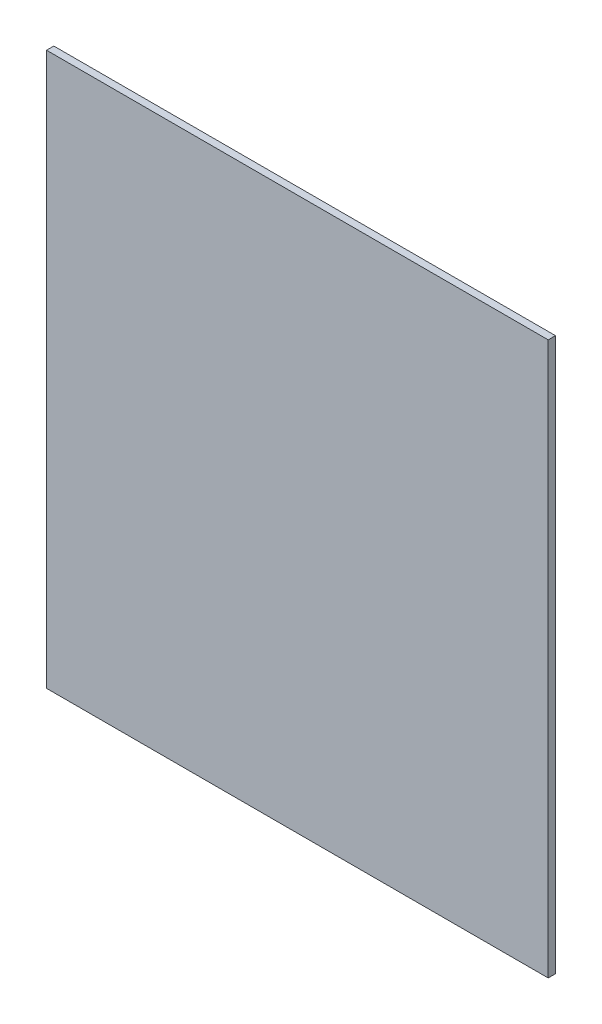
ISO-10303-21;
HEADER;
FILE_DESCRIPTION(('STEP AP214'),'2;1');
FILE_NAME('part.step','',(''),(''),'','','');
FILE_SCHEMA(('AUTOMOTIVE_DESIGN { 1 0 10303 214 1 1 1 1 }'));
ENDSEC;
DATA;
#1=APPLICATION_CONTEXT('core data for automotive mechanical design processes');
#2=APPLICATION_PROTOCOL_DEFINITION('international standard','automotive_design',2000,#1);
#3=PRODUCT_CONTEXT('',#1,'mechanical');
#4=PRODUCT('Part','Part','',(#3));
#5=PRODUCT_RELATED_PRODUCT_CATEGORY('part','',(#4));
#6=PRODUCT_DEFINITION_FORMATION('','',#4);
#7=PRODUCT_DEFINITION_CONTEXT('part definition',#1,'design');
#8=PRODUCT_DEFINITION('design','',#6,#7);
#9=PRODUCT_DEFINITION_SHAPE('','',#8);
#10=(LENGTH_UNIT() NAMED_UNIT(*) SI_UNIT(.MILLI.,.METRE.));
#11=(NAMED_UNIT(*) PLANE_ANGLE_UNIT() SI_UNIT($,.RADIAN.));
#12=(NAMED_UNIT(*) SI_UNIT($,.STERADIAN.) SOLID_ANGLE_UNIT());
#13=UNCERTAINTY_MEASURE_WITH_UNIT(LENGTH_MEASURE(1.E-05),#10,'distance_accuracy_value','');
#14=(GEOMETRIC_REPRESENTATION_CONTEXT(3) GLOBAL_UNCERTAINTY_ASSIGNED_CONTEXT((#13)) GLOBAL_UNIT_ASSIGNED_CONTEXT((#10,
#11,#12)) REPRESENTATION_CONTEXT('',''));
#15=CARTESIAN_POINT('',(0.,0.,0.));
#16=DIRECTION('',(0.,0.,1.));
#17=DIRECTION('',(1.,0.,0.));
#18=AXIS2_PLACEMENT_3D('',#15,#16,#17);
#19=CARTESIAN_POINT('',(0.,0.,0.));
#20=DIRECTION('',(0.,0.,1.));
#21=DIRECTION('',(1.,0.,0.));
#22=AXIS2_PLACEMENT_3D('',#19,#20,#21);
#23=PLANE('',#22);
#24=DIRECTION('',(0.,-1.,0.));
#25=VECTOR('',#24,1.);
#26=CARTESIAN_POINT('',(-28.9650792305083,6.16507923050825,0.));
#27=LINE('',#26,#25);
#28=CARTESIAN_POINT('',(-28.9650792305083,6.16507923050825,0.));
#29=VERTEX_POINT('',#28);
#30=CARTESIAN_POINT('',(-28.9650792305083,-69.7650792305083,0.));
#31=VERTEX_POINT('',#30);
#32=EDGE_CURVE('E118',#29,#31,#27,.T.);
#33=ORIENTED_EDGE('',*,*,#32,.F.);
#34=DIRECTION('',(-1.,0.,0.));
#35=VECTOR('',#34,1.);
#36=CARTESIAN_POINT('',(39.9650792305082,6.16507923050826,0.));
#37=LINE('',#36,#35);
#38=CARTESIAN_POINT('',(39.9650792305082,6.16507923050826,0.));
#39=VERTEX_POINT('',#38);
#40=EDGE_CURVE('E131',#39,#29,#37,.T.);
#41=ORIENTED_EDGE('',*,*,#40,.F.);
#42=DIRECTION('',(0.,1.,0.));
#43=VECTOR('',#42,1.);
#44=CARTESIAN_POINT('',(39.9650792305082,-69.7650792305082,0.));
#45=LINE('',#44,#43);
#46=CARTESIAN_POINT('',(39.9650792305082,-69.7650792305082,0.));
#47=VERTEX_POINT('',#46);
#48=EDGE_CURVE('E139',#47,#39,#45,.T.);
#49=ORIENTED_EDGE('',*,*,#48,.F.);
#50=DIRECTION('',(1.,0.,0.));
#51=VECTOR('',#50,1.);
#52=CARTESIAN_POINT('',(-28.9650792305083,-69.7650792305083,0.));
#53=LINE('',#52,#51);
#54=EDGE_CURVE('E121',#31,#47,#53,.T.);
#55=ORIENTED_EDGE('',*,*,#54,.F.);
#56=EDGE_LOOP('',(#33,#41,#49,#55));
#57=FACE_BOUND('',#56,.T.);
#58=DIRECTION('',(1.,0.,0.));
#59=VECTOR('',#58,1.);
#60=CARTESIAN_POINT('',(-5.46507923050828,-60.4650792305083,0.));
#61=LINE('',#60,#59);
#62=CARTESIAN_POINT('',(-5.46507923050828,-60.4650792305083,0.));
#63=VERTEX_POINT('',#62);
#64=CARTESIAN_POINT('',(18.5349207694917,-60.4650792305083,0.));
#65=VERTEX_POINT('',#64);
#66=EDGE_CURVE('E117',#63,#65,#61,.T.);
#67=ORIENTED_EDGE('',*,*,#66,.F.);
#68=DIRECTION('',(0.,1.,0.));
#69=VECTOR('',#68,1.);
#70=CARTESIAN_POINT('',(-5.46507923050828,-64.4650792305083,0.));
#71=LINE('',#70,#69);
#72=CARTESIAN_POINT('',(-5.46507923050828,-64.4650792305083,0.));
#73=VERTEX_POINT('',#72);
#74=EDGE_CURVE('E114',#73,#63,#71,.T.);
#75=ORIENTED_EDGE('',*,*,#74,.F.);
#76=DIRECTION('',(-1.,0.,0.));
#77=VECTOR('',#76,1.);
#78=CARTESIAN_POINT('',(18.5349207694917,-64.4650792305083,0.));
#79=LINE('',#78,#77);
#80=CARTESIAN_POINT('',(18.5349207694917,-64.4650792305083,0.));
#81=VERTEX_POINT('',#80);
#82=EDGE_CURVE('E52',#81,#73,#79,.T.);
#83=ORIENTED_EDGE('',*,*,#82,.F.);
#84=DIRECTION('',(0.,-1.,0.));
#85=VECTOR('',#84,1.);
#86=CARTESIAN_POINT('',(18.5349207694917,-60.4650792305083,0.));
#87=LINE('',#86,#85);
#88=EDGE_CURVE('E47',#65,#81,#87,.T.);
#89=ORIENTED_EDGE('',*,*,#88,.F.);
#90=EDGE_LOOP('',(#67,#75,#83,#89));
#91=FACE_BOUND('',#90,.T.);
#92=ADVANCED_FACE('F32',(#57,#91),#23,.F.);
#93=CARTESIAN_POINT('',(-28.9650792305083,6.16507923050825,1.));
#94=DIRECTION('',(1.,0.,0.));
#95=DIRECTION('',(0.,0.,-1.));
#96=AXIS2_PLACEMENT_3D('',#93,#94,#95);
#97=PLANE('',#96);
#98=ORIENTED_EDGE('',*,*,#32,.T.);
#99=DIRECTION('',(0.,0.,-1.));
#100=VECTOR('',#99,1.);
#101=CARTESIAN_POINT('',(-28.9650792305083,-69.7650792305083,1.));
#102=LINE('',#101,#100);
#103=CARTESIAN_POINT('',(-28.9650792305083,-69.7650792305083,1.));
#104=VERTEX_POINT('',#103);
#105=EDGE_CURVE('E11',#104,#31,#102,.T.);
#106=ORIENTED_EDGE('',*,*,#105,.F.);
#107=DIRECTION('',(0.,-1.,0.));
#108=VECTOR('',#107,1.);
#109=CARTESIAN_POINT('',(-28.9650792305083,6.16507923050825,1.));
#110=LINE('',#109,#108);
#111=CARTESIAN_POINT('',(-28.9650792305083,6.16507923050825,1.));
#112=VERTEX_POINT('',#111);
#113=EDGE_CURVE('E127',#112,#104,#110,.T.);
#114=ORIENTED_EDGE('',*,*,#113,.F.);
#115=DIRECTION('',(0.,0.,-1.));
#116=VECTOR('',#115,1.);
#117=CARTESIAN_POINT('',(-28.9650792305083,6.16507923050825,1.));
#118=LINE('',#117,#116);
#119=EDGE_CURVE('E136',#112,#29,#118,.T.);
#120=ORIENTED_EDGE('',*,*,#119,.T.);
#121=EDGE_LOOP('',(#98,#106,#114,#120));
#122=FACE_BOUND('',#121,.T.);
#123=ADVANCED_FACE('F34',(#122),#97,.F.);
#124=CARTESIAN_POINT('',(-28.9650792305083,-69.7650792305083,1.));
#125=DIRECTION('',(0.,1.,0.));
#126=DIRECTION('',(-1.,0.,0.));
#127=AXIS2_PLACEMENT_3D('',#124,#125,#126);
#128=PLANE('',#127);
#129=ORIENTED_EDGE('',*,*,#54,.T.);
#130=DIRECTION('',(0.,0.,-1.));
#131=VECTOR('',#130,1.);
#132=CARTESIAN_POINT('',(39.9650792305082,-69.7650792305082,1.));
#133=LINE('',#132,#131);
#134=CARTESIAN_POINT('',(39.9650792305082,-69.7650792305082,1.));
#135=VERTEX_POINT('',#134);
#136=EDGE_CURVE('E40',#135,#47,#133,.T.);
#137=ORIENTED_EDGE('',*,*,#136,.F.);
#138=DIRECTION('',(1.,0.,0.));
#139=VECTOR('',#138,1.);
#140=CARTESIAN_POINT('',(-28.9650792305083,-69.7650792305083,1.));
#141=LINE('',#140,#139);
#142=EDGE_CURVE('E130',#104,#135,#141,.T.);
#143=ORIENTED_EDGE('',*,*,#142,.F.);
#144=ORIENTED_EDGE('',*,*,#105,.T.);
#145=EDGE_LOOP('',(#129,#137,#143,#144));
#146=FACE_BOUND('',#145,.T.);
#147=ADVANCED_FACE('F166',(#146),#128,.F.);
#148=CARTESIAN_POINT('',(39.9650792305082,-69.7650792305082,1.));
#149=DIRECTION('',(-1.,0.,0.));
#150=DIRECTION('',(0.,0.,1.));
#151=AXIS2_PLACEMENT_3D('',#148,#149,#150);
#152=PLANE('',#151);
#153=ORIENTED_EDGE('',*,*,#48,.T.);
#154=DIRECTION('',(0.,0.,-1.));
#155=VECTOR('',#154,1.);
#156=CARTESIAN_POINT('',(39.9650792305082,6.16507923050826,1.));
#157=LINE('',#156,#155);
#158=CARTESIAN_POINT('',(39.9650792305082,6.16507923050826,1.));
#159=VERTEX_POINT('',#158);
#160=EDGE_CURVE('E144',#159,#39,#157,.T.);
#161=ORIENTED_EDGE('',*,*,#160,.F.);
#162=DIRECTION('',(0.,1.,0.));
#163=VECTOR('',#162,1.);
#164=CARTESIAN_POINT('',(39.9650792305082,-69.7650792305082,1.));
#165=LINE('',#164,#163);
#166=EDGE_CURVE('E133',#135,#159,#165,.T.);
#167=ORIENTED_EDGE('',*,*,#166,.F.);
#168=ORIENTED_EDGE('',*,*,#136,.T.);
#169=EDGE_LOOP('',(#153,#161,#167,#168));
#170=FACE_BOUND('',#169,.T.);
#171=ADVANCED_FACE('F151',(#170),#152,.F.);
#172=CARTESIAN_POINT('',(39.9650792305082,6.16507923050826,1.));
#173=DIRECTION('',(0.,-1.,0.));
#174=DIRECTION('',(1.,0.,0.));
#175=AXIS2_PLACEMENT_3D('',#172,#173,#174);
#176=PLANE('',#175);
#177=ORIENTED_EDGE('',*,*,#40,.T.);
#178=ORIENTED_EDGE('',*,*,#119,.F.);
#179=DIRECTION('',(-1.,0.,0.));
#180=VECTOR('',#179,1.);
#181=CARTESIAN_POINT('',(39.9650792305082,6.16507923050826,1.));
#182=LINE('',#181,#180);
#183=EDGE_CURVE('E135',#159,#112,#182,.T.);
#184=ORIENTED_EDGE('',*,*,#183,.F.);
#185=ORIENTED_EDGE('',*,*,#160,.T.);
#186=EDGE_LOOP('',(#177,#178,#184,#185));
#187=FACE_BOUND('',#186,.T.);
#188=ADVANCED_FACE('F159',(#187),#176,.F.);
#189=CARTESIAN_POINT('',(0.,0.,1.));
#190=DIRECTION('',(0.,0.,1.));
#191=DIRECTION('',(1.,0.,0.));
#192=AXIS2_PLACEMENT_3D('',#189,#190,#191);
#193=PLANE('',#192);
#194=ORIENTED_EDGE('',*,*,#113,.T.);
#195=ORIENTED_EDGE('',*,*,#142,.T.);
#196=ORIENTED_EDGE('',*,*,#166,.T.);
#197=ORIENTED_EDGE('',*,*,#183,.T.);
#198=EDGE_LOOP('',(#194,#195,#196,#197));
#199=FACE_BOUND('',#198,.T.);
#200=ADVANCED_FACE('F165',(#199),#193,.T.);
#201=CARTESIAN_POINT('',(-5.46507923050828,-60.4650792305083,-5.));
#202=DIRECTION('',(0.,-1.,0.));
#203=DIRECTION('',(0.,0.,-1.));
#204=AXIS2_PLACEMENT_3D('',#201,#202,#203);
#205=PLANE('',#204);
#206=ORIENTED_EDGE('',*,*,#66,.T.);
#207=DIRECTION('',(0.,0.,1.));
#208=VECTOR('',#207,1.);
#209=CARTESIAN_POINT('',(18.5349207694917,-60.4650792305083,-5.));
#210=LINE('',#209,#208);
#211=CARTESIAN_POINT('',(18.5349207694917,-60.4650792305083,-5.));
#212=VERTEX_POINT('',#211);
#213=EDGE_CURVE('E98',#212,#65,#210,.T.);
#214=ORIENTED_EDGE('',*,*,#213,.F.);
#215=DIRECTION('',(1.,0.,0.));
#216=VECTOR('',#215,1.);
#217=CARTESIAN_POINT('',(-5.46507923050828,-60.4650792305083,-5.));
#218=LINE('',#217,#216);
#219=CARTESIAN_POINT('',(-5.46507923050828,-60.4650792305083,-5.));
#220=VERTEX_POINT('',#219);
#221=EDGE_CURVE('E105',#220,#212,#218,.T.);
#222=ORIENTED_EDGE('',*,*,#221,.F.);
#223=DIRECTION('',(0.,0.,1.));
#224=VECTOR('',#223,1.);
#225=CARTESIAN_POINT('',(-5.46507923050828,-60.4650792305083,-5.));
#226=LINE('',#225,#224);
#227=EDGE_CURVE('E259',#220,#63,#226,.T.);
#228=ORIENTED_EDGE('',*,*,#227,.T.);
#229=EDGE_LOOP('',(#206,#214,#222,#228));
#230=FACE_BOUND('',#229,.T.);
#231=ADVANCED_FACE('F116',(#230),#205,.F.);
#232=CARTESIAN_POINT('',(18.5349207694917,-60.4650792305083,-5.));
#233=DIRECTION('',(-1.,0.,0.));
#234=DIRECTION('',(0.,0.,1.));
#235=AXIS2_PLACEMENT_3D('',#232,#233,#234);
#236=PLANE('',#235);
#237=ORIENTED_EDGE('',*,*,#88,.T.);
#238=DIRECTION('',(0.,0.,1.));
#239=VECTOR('',#238,1.);
#240=CARTESIAN_POINT('',(18.5349207694917,-64.4650792305083,-5.));
#241=LINE('',#240,#239);
#242=CARTESIAN_POINT('',(18.5349207694917,-64.4650792305083,-5.));
#243=VERTEX_POINT('',#242);
#244=EDGE_CURVE('E101',#243,#81,#241,.T.);
#245=ORIENTED_EDGE('',*,*,#244,.F.);
#246=DIRECTION('',(0.,-1.,0.));
#247=VECTOR('',#246,1.);
#248=CARTESIAN_POINT('',(18.5349207694917,-60.4650792305083,-5.));
#249=LINE('',#248,#247);
#250=EDGE_CURVE('E94',#212,#243,#249,.T.);
#251=ORIENTED_EDGE('',*,*,#250,.F.);
#252=ORIENTED_EDGE('',*,*,#213,.T.);
#253=EDGE_LOOP('',(#237,#245,#251,#252));
#254=FACE_BOUND('',#253,.T.);
#255=ADVANCED_FACE('F96',(#254),#236,.F.);
#256=CARTESIAN_POINT('',(18.5349207694917,-64.4650792305083,-5.));
#257=DIRECTION('',(0.,1.,0.));
#258=DIRECTION('',(0.,0.,1.));
#259=AXIS2_PLACEMENT_3D('',#256,#257,#258);
#260=PLANE('',#259);
#261=ORIENTED_EDGE('',*,*,#82,.T.);
#262=DIRECTION('',(0.,0.,1.));
#263=VECTOR('',#262,1.);
#264=CARTESIAN_POINT('',(-5.46507923050828,-64.4650792305083,-5.));
#265=LINE('',#264,#263);
#266=CARTESIAN_POINT('',(-5.46507923050828,-64.4650792305083,-5.));
#267=VERTEX_POINT('',#266);
#268=EDGE_CURVE('E123',#267,#73,#265,.T.);
#269=ORIENTED_EDGE('',*,*,#268,.F.);
#270=DIRECTION('',(-1.,0.,0.));
#271=VECTOR('',#270,1.);
#272=CARTESIAN_POINT('',(18.5349207694917,-64.4650792305083,-5.));
#273=LINE('',#272,#271);
#274=EDGE_CURVE('E104',#243,#267,#273,.T.);
#275=ORIENTED_EDGE('',*,*,#274,.F.);
#276=ORIENTED_EDGE('',*,*,#244,.T.);
#277=EDGE_LOOP('',(#261,#269,#275,#276));
#278=FACE_BOUND('',#277,.T.);
#279=ADVANCED_FACE('F190',(#278),#260,.F.);
#280=CARTESIAN_POINT('',(-5.46507923050828,-64.4650792305083,-5.));
#281=DIRECTION('',(1.,0.,0.));
#282=DIRECTION('',(0.,0.,-1.));
#283=AXIS2_PLACEMENT_3D('',#280,#281,#282);
#284=PLANE('',#283);
#285=ORIENTED_EDGE('',*,*,#74,.T.);
#286=ORIENTED_EDGE('',*,*,#227,.F.);
#287=DIRECTION('',(0.,1.,0.));
#288=VECTOR('',#287,1.);
#289=CARTESIAN_POINT('',(-5.46507923050828,-64.4650792305083,-5.));
#290=LINE('',#289,#288);
#291=EDGE_CURVE('E110',#267,#220,#290,.T.);
#292=ORIENTED_EDGE('',*,*,#291,.F.);
#293=ORIENTED_EDGE('',*,*,#268,.T.);
#294=EDGE_LOOP('',(#285,#286,#292,#293));
#295=FACE_BOUND('',#294,.T.);
#296=ADVANCED_FACE('F195',(#295),#284,.F.);
#297=CARTESIAN_POINT('',(0.,0.,-5.));
#298=DIRECTION('',(0.,0.,-1.));
#299=DIRECTION('',(-1.,0.,0.));
#300=AXIS2_PLACEMENT_3D('',#297,#298,#299);
#301=PLANE('',#300);
#302=ORIENTED_EDGE('',*,*,#221,.T.);
#303=ORIENTED_EDGE('',*,*,#250,.T.);
#304=ORIENTED_EDGE('',*,*,#274,.T.);
#305=ORIENTED_EDGE('',*,*,#291,.T.);
#306=EDGE_LOOP('',(#302,#303,#304,#305));
#307=FACE_BOUND('',#306,.T.);
#308=ADVANCED_FACE('F108',(#307),#301,.T.);
#309=CLOSED_SHELL('',(#92,#123,#147,#171,#188,#200,#231,#255,#279,#296,#308));
#310=MANIFOLD_SOLID_BREP('B2',#309);
#311=ADVANCED_BREP_SHAPE_REPRESENTATION('',(#18,#310),#14);
#312=SHAPE_DEFINITION_REPRESENTATION(#9,#311);
ENDSEC;
END-ISO-10303-21;
